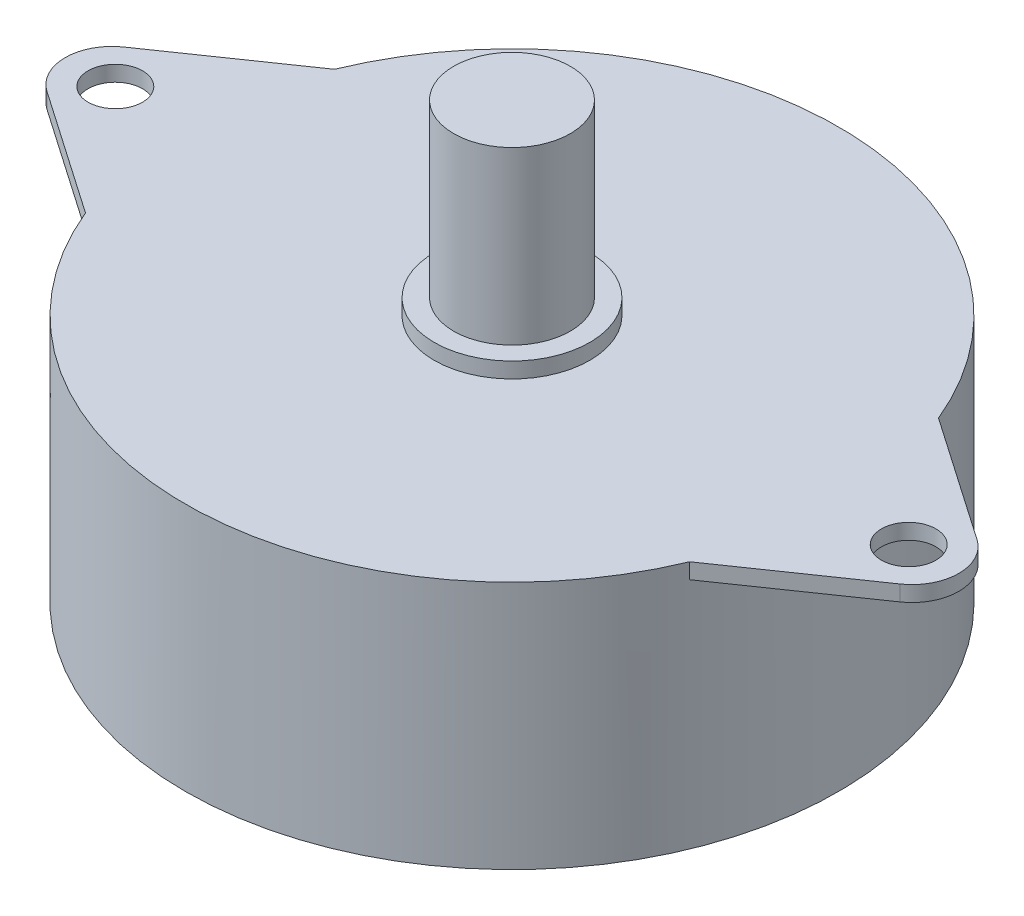
ISO-10303-21;
HEADER;
FILE_DESCRIPTION(('STEP AP214'),'2;1');
FILE_NAME('part.step','',(''),(''),'','','');
FILE_SCHEMA(('AUTOMOTIVE_DESIGN { 1 0 10303 214 1 1 1 1 }'));
ENDSEC;
DATA;
#1=APPLICATION_CONTEXT('core data for automotive mechanical design processes');
#2=APPLICATION_PROTOCOL_DEFINITION('international standard','automotive_design',2000,#1);
#3=PRODUCT_CONTEXT('',#1,'mechanical');
#4=PRODUCT('Part','Part','',(#3));
#5=PRODUCT_RELATED_PRODUCT_CATEGORY('part','',(#4));
#6=PRODUCT_DEFINITION_FORMATION('','',#4);
#7=PRODUCT_DEFINITION_CONTEXT('part definition',#1,'design');
#8=PRODUCT_DEFINITION('design','',#6,#7);
#9=PRODUCT_DEFINITION_SHAPE('','',#8);
#10=(LENGTH_UNIT() NAMED_UNIT(*) SI_UNIT(.MILLI.,.METRE.));
#11=(NAMED_UNIT(*) PLANE_ANGLE_UNIT() SI_UNIT($,.RADIAN.));
#12=(NAMED_UNIT(*) SI_UNIT($,.STERADIAN.) SOLID_ANGLE_UNIT());
#13=UNCERTAINTY_MEASURE_WITH_UNIT(LENGTH_MEASURE(1.E-05),#10,'distance_accuracy_value','');
#14=(GEOMETRIC_REPRESENTATION_CONTEXT(3) GLOBAL_UNCERTAINTY_ASSIGNED_CONTEXT((#13)) GLOBAL_UNIT_ASSIGNED_CONTEXT((#10,
#11,#12)) REPRESENTATION_CONTEXT('',''));
#15=CARTESIAN_POINT('',(0.,0.,0.));
#16=DIRECTION('',(0.,0.,1.));
#17=DIRECTION('',(1.,0.,0.));
#18=AXIS2_PLACEMENT_3D('',#15,#16,#17);
#19=CARTESIAN_POINT('',(0.,17.,0.));
#20=DIRECTION('',(0.,1.,0.));
#21=DIRECTION('',(0.,0.,1.));
#22=AXIS2_PLACEMENT_3D('',#19,#20,#21);
#23=PLANE('',#22);
#24=CARTESIAN_POINT('',(0.,17.,0.));
#25=DIRECTION('',(0.,1.,0.));
#26=DIRECTION('',(0.,0.,1.));
#27=AXIS2_PLACEMENT_3D('',#24,#25,#26);
#28=CIRCLE('',#27,5.);
#29=CARTESIAN_POINT('',(0.,17.,5.));
#30=VERTEX_POINT('',#29);
#31=EDGE_CURVE('E185',#30,#30,#28,.T.);
#32=ORIENTED_EDGE('',*,*,#31,.T.);
#33=EDGE_LOOP('',(#32));
#34=FACE_BOUND('',#33,.T.);
#35=CARTESIAN_POINT('',(0.,17.,0.));
#36=DIRECTION('',(0.,1.,0.));
#37=DIRECTION('',(0.,0.,1.));
#38=AXIS2_PLACEMENT_3D('',#35,#36,#37);
#39=CIRCLE('',#38,3.75);
#40=CARTESIAN_POINT('',(0.,17.,3.75));
#41=VERTEX_POINT('',#40);
#42=EDGE_CURVE('E194',#41,#41,#39,.T.);
#43=ORIENTED_EDGE('',*,*,#42,.F.);
#44=EDGE_LOOP('',(#43));
#45=FACE_BOUND('',#44,.T.);
#46=ADVANCED_FACE('F31',(#34,#45),#23,.T.);
#47=CARTESIAN_POINT('',(0.,16.,0.));
#48=DIRECTION('',(0.,1.,0.));
#49=DIRECTION('',(0.,0.,1.));
#50=AXIS2_PLACEMENT_3D('',#47,#48,#49);
#51=PLANE('',#50);
#52=CARTESIAN_POINT('',(25.5,16.,0.));
#53=DIRECTION('',(0.,1.,0.));
#54=DIRECTION('',(0.,0.,1.));
#55=AXIS2_PLACEMENT_3D('',#52,#53,#54);
#56=CIRCLE('',#55,1.75);
#57=CARTESIAN_POINT('',(25.5,16.,1.75));
#58=VERTEX_POINT('',#57);
#59=EDGE_CURVE('E182',#58,#58,#56,.T.);
#60=ORIENTED_EDGE('',*,*,#59,.F.);
#61=EDGE_LOOP('',(#60));
#62=FACE_BOUND('',#61,.T.);
#63=CARTESIAN_POINT('',(-25.5,16.,0.));
#64=DIRECTION('',(0.,1.,0.));
#65=DIRECTION('',(0.,0.,1.));
#66=AXIS2_PLACEMENT_3D('',#63,#64,#65);
#67=CIRCLE('',#66,1.75);
#68=CARTESIAN_POINT('',(-25.5,16.,1.75));
#69=VERTEX_POINT('',#68);
#70=EDGE_CURVE('E176',#69,#69,#67,.T.);
#71=ORIENTED_EDGE('',*,*,#70,.F.);
#72=EDGE_LOOP('',(#71));
#73=FACE_BOUND('',#72,.T.);
#74=CARTESIAN_POINT('',(0.,16.,0.));
#75=DIRECTION('',(0.,1.,0.));
#76=DIRECTION('',(0.,0.,1.));
#77=AXIS2_PLACEMENT_3D('',#74,#75,#76);
#78=CIRCLE('',#77,21.);
#79=CARTESIAN_POINT('',(19.4164878389476,16.,-8.00000000000001));
#80=VERTEX_POINT('',#79);
#81=CARTESIAN_POINT('',(-19.4164878389476,16.,-8.));
#82=VERTEX_POINT('',#81);
#83=EDGE_CURVE('E123',#80,#82,#78,.T.);
#84=ORIENTED_EDGE('',*,*,#83,.T.);
#85=DIRECTION('',(-0.822835097373695,0.,0.568280214797262));
#86=VECTOR('',#85,1.);
#87=CARTESIAN_POINT('',(-27.4257548661366,16.,-2.4685052921211));
#88=LINE('',#87,#86);
#89=CARTESIAN_POINT('',(-27.4257548661366,16.,-2.4685052921211));
#90=VERTEX_POINT('',#89);
#91=EDGE_CURVE('E152',#82,#90,#88,.T.);
#92=ORIENTED_EDGE('',*,*,#91,.T.);
#93=CARTESIAN_POINT('',(-25.7209142217449,16.,0.));
#94=DIRECTION('',(0.,1.,0.));
#95=DIRECTION('',(0.,0.,1.));
#96=AXIS2_PLACEMENT_3D('',#93,#94,#95);
#97=CIRCLE('',#96,3.);
#98=CARTESIAN_POINT('',(-27.4257548661366,16.,2.4685052921211));
#99=VERTEX_POINT('',#98);
#100=EDGE_CURVE('E158',#90,#99,#97,.T.);
#101=ORIENTED_EDGE('',*,*,#100,.T.);
#102=DIRECTION('',(0.822835097373695,0.,0.568280214797262));
#103=VECTOR('',#102,1.);
#104=CARTESIAN_POINT('',(-19.4164878389476,16.,8.));
#105=LINE('',#104,#103);
#106=CARTESIAN_POINT('',(-19.4164878389476,16.,8.00000000000001));
#107=VERTEX_POINT('',#106);
#108=EDGE_CURVE('E46',#99,#107,#105,.T.);
#109=ORIENTED_EDGE('',*,*,#108,.T.);
#110=CARTESIAN_POINT('',(19.4164878389476,16.,8.));
#111=VERTEX_POINT('',#110);
#112=EDGE_CURVE('E134',#107,#111,#78,.T.);
#113=ORIENTED_EDGE('',*,*,#112,.T.);
#114=DIRECTION('',(0.822835097373695,0.,-0.568280214797262));
#115=VECTOR('',#114,1.);
#116=CARTESIAN_POINT('',(27.4257548661366,16.,2.4685052921211));
#117=LINE('',#116,#115);
#118=CARTESIAN_POINT('',(27.4257548661366,16.,2.4685052921211));
#119=VERTEX_POINT('',#118);
#120=EDGE_CURVE('E103',#111,#119,#117,.T.);
#121=ORIENTED_EDGE('',*,*,#120,.T.);
#122=CARTESIAN_POINT('',(25.7209142217449,16.,0.));
#123=DIRECTION('',(0.,1.,0.));
#124=DIRECTION('',(0.,0.,-1.));
#125=AXIS2_PLACEMENT_3D('',#122,#123,#124);
#126=CIRCLE('',#125,3.);
#127=CARTESIAN_POINT('',(27.4257548661366,16.,-2.4685052921211));
#128=VERTEX_POINT('',#127);
#129=EDGE_CURVE('E163',#119,#128,#126,.T.);
#130=ORIENTED_EDGE('',*,*,#129,.T.);
#131=DIRECTION('',(-0.822835097373695,0.,-0.568280214797262));
#132=VECTOR('',#131,1.);
#133=CARTESIAN_POINT('',(19.4164878389476,16.,-8.));
#134=LINE('',#133,#132);
#135=EDGE_CURVE('E53',#128,#80,#134,.T.);
#136=ORIENTED_EDGE('',*,*,#135,.T.);
#137=EDGE_LOOP('',(#84,#92,#101,#109,#113,#121,#130,#136));
#138=FACE_BOUND('',#137,.T.);
#139=CARTESIAN_POINT('',(0.,16.,0.));
#140=DIRECTION('',(0.,1.,0.));
#141=DIRECTION('',(0.,0.,1.));
#142=AXIS2_PLACEMENT_3D('',#139,#140,#141);
#143=CIRCLE('',#142,5.);
#144=CARTESIAN_POINT('',(0.,16.,5.));
#145=VERTEX_POINT('',#144);
#146=EDGE_CURVE('E188',#145,#145,#143,.T.);
#147=ORIENTED_EDGE('',*,*,#146,.F.);
#148=EDGE_LOOP('',(#147));
#149=FACE_BOUND('',#148,.T.);
#150=ADVANCED_FACE('F160',(#62,#73,#138,#149),#51,.T.);
#151=CARTESIAN_POINT('',(0.,16.,0.));
#152=DIRECTION('',(0.,-1.,0.));
#153=DIRECTION('',(0.,0.,-1.));
#154=AXIS2_PLACEMENT_3D('',#151,#152,#153);
#155=CYLINDRICAL_SURFACE('',#154,21.);
#156=ORIENTED_EDGE('',*,*,#83,.F.);
#157=DIRECTION('',(0.,1.,0.));
#158=VECTOR('',#157,1.);
#159=CARTESIAN_POINT('',(19.4164878389476,15.,-8.));
#160=LINE('',#159,#158);
#161=CARTESIAN_POINT('',(19.4164878389476,15.,-8.));
#162=VERTEX_POINT('',#161);
#163=EDGE_CURVE('E121',#162,#80,#160,.T.);
#164=ORIENTED_EDGE('',*,*,#163,.F.);
#165=CARTESIAN_POINT('',(0.,15.,0.));
#166=DIRECTION('',(0.,1.,0.));
#167=DIRECTION('',(0.,0.,1.));
#168=AXIS2_PLACEMENT_3D('',#165,#166,#167);
#169=CIRCLE('',#168,21.);
#170=CARTESIAN_POINT('',(19.4164878389476,15.,8.));
#171=VERTEX_POINT('',#170);
#172=EDGE_CURVE('E11',#171,#162,#169,.T.);
#173=ORIENTED_EDGE('',*,*,#172,.F.);
#174=DIRECTION('',(0.,1.,0.));
#175=VECTOR('',#174,1.);
#176=CARTESIAN_POINT('',(19.4164878389476,15.,8.));
#177=LINE('',#176,#175);
#178=EDGE_CURVE('E98',#171,#111,#177,.T.);
#179=ORIENTED_EDGE('',*,*,#178,.T.);
#180=ORIENTED_EDGE('',*,*,#112,.F.);
#181=DIRECTION('',(0.,1.,0.));
#182=VECTOR('',#181,1.);
#183=CARTESIAN_POINT('',(-19.4164878389476,15.,8.));
#184=LINE('',#183,#182);
#185=CARTESIAN_POINT('',(-19.4164878389476,15.,8.));
#186=VERTEX_POINT('',#185);
#187=EDGE_CURVE('E137',#186,#107,#184,.T.);
#188=ORIENTED_EDGE('',*,*,#187,.F.);
#189=CARTESIAN_POINT('',(-19.4164878389476,15.,-8.));
#190=VERTEX_POINT('',#189);
#191=EDGE_CURVE('E35',#190,#186,#169,.T.);
#192=ORIENTED_EDGE('',*,*,#191,.F.);
#193=DIRECTION('',(0.,1.,0.));
#194=VECTOR('',#193,1.);
#195=CARTESIAN_POINT('',(-19.4164878389476,15.,-8.));
#196=LINE('',#195,#194);
#197=EDGE_CURVE('E125',#190,#82,#196,.T.);
#198=ORIENTED_EDGE('',*,*,#197,.T.);
#199=EDGE_LOOP('',(#156,#164,#173,#179,#180,#188,#192,#198));
#200=FACE_BOUND('',#199,.T.);
#201=CARTESIAN_POINT('',(0.,0.,0.));
#202=DIRECTION('',(0.,1.,0.));
#203=DIRECTION('',(0.,0.,1.));
#204=AXIS2_PLACEMENT_3D('',#201,#202,#203);
#205=CIRCLE('',#204,21.);
#206=CARTESIAN_POINT('',(0.,0.,21.));
#207=VERTEX_POINT('',#206);
#208=EDGE_CURVE('E135',#207,#207,#205,.T.);
#209=ORIENTED_EDGE('',*,*,#208,.T.);
#210=EDGE_LOOP('',(#209));
#211=FACE_BOUND('',#210,.T.);
#212=ADVANCED_FACE('F33',(#200,#211),#155,.T.);
#213=CARTESIAN_POINT('',(0.,0.,0.));
#214=DIRECTION('',(0.,1.,0.));
#215=DIRECTION('',(0.,0.,1.));
#216=AXIS2_PLACEMENT_3D('',#213,#214,#215);
#217=PLANE('',#216);
#218=ORIENTED_EDGE('',*,*,#208,.F.);
#219=EDGE_LOOP('',(#218));
#220=FACE_BOUND('',#219,.T.);
#221=ADVANCED_FACE('F240',(#220),#217,.F.);
#222=CARTESIAN_POINT('',(-25.7209142217449,15.,0.));
#223=DIRECTION('',(0.,1.,0.));
#224=DIRECTION('',(0.,0.,1.));
#225=AXIS2_PLACEMENT_3D('',#222,#223,#224);
#226=CYLINDRICAL_SURFACE('',#225,3.);
#227=ORIENTED_EDGE('',*,*,#100,.F.);
#228=DIRECTION('',(0.,1.,0.));
#229=VECTOR('',#228,1.);
#230=CARTESIAN_POINT('',(-27.4257548661366,15.,-2.4685052921211));
#231=LINE('',#230,#229);
#232=CARTESIAN_POINT('',(-27.4257548661366,15.,-2.4685052921211));
#233=VERTEX_POINT('',#232);
#234=EDGE_CURVE('E128',#233,#90,#231,.T.);
#235=ORIENTED_EDGE('',*,*,#234,.F.);
#236=CARTESIAN_POINT('',(-25.7209142217449,15.,0.));
#237=DIRECTION('',(0.,1.,0.));
#238=DIRECTION('',(0.,0.,1.));
#239=AXIS2_PLACEMENT_3D('',#236,#237,#238);
#240=CIRCLE('',#239,3.);
#241=CARTESIAN_POINT('',(-27.4257548661366,15.,2.4685052921211));
#242=VERTEX_POINT('',#241);
#243=EDGE_CURVE('E170',#233,#242,#240,.T.);
#244=ORIENTED_EDGE('',*,*,#243,.T.);
#245=DIRECTION('',(0.,1.,0.));
#246=VECTOR('',#245,1.);
#247=CARTESIAN_POINT('',(-27.4257548661366,15.,2.4685052921211));
#248=LINE('',#247,#246);
#249=EDGE_CURVE('E139',#242,#99,#248,.T.);
#250=ORIENTED_EDGE('',*,*,#249,.T.);
#251=EDGE_LOOP('',(#227,#235,#244,#250));
#252=FACE_BOUND('',#251,.T.);
#253=ADVANCED_FACE('F159',(#252),#226,.T.);
#254=CARTESIAN_POINT('',(-25.5,15.,0.));
#255=DIRECTION('',(0.,1.,0.));
#256=DIRECTION('',(0.,0.,1.));
#257=AXIS2_PLACEMENT_3D('',#254,#255,#256);
#258=CYLINDRICAL_SURFACE('',#257,1.75);
#259=CARTESIAN_POINT('',(-25.5,15.,0.));
#260=DIRECTION('',(0.,1.,0.));
#261=DIRECTION('',(0.,0.,1.));
#262=AXIS2_PLACEMENT_3D('',#259,#260,#261);
#263=CIRCLE('',#262,1.75);
#264=CARTESIAN_POINT('',(-25.5,15.,1.75));
#265=VERTEX_POINT('',#264);
#266=EDGE_CURVE('E168',#265,#265,#263,.T.);
#267=ORIENTED_EDGE('',*,*,#266,.F.);
#268=EDGE_LOOP('',(#267));
#269=FACE_BOUND('',#268,.T.);
#270=ORIENTED_EDGE('',*,*,#70,.T.);
#271=EDGE_LOOP('',(#270));
#272=FACE_BOUND('',#271,.T.);
#273=ADVANCED_FACE('F226',(#269,#272),#258,.F.);
#274=CARTESIAN_POINT('',(-25.7209142217449,15.,0.));
#275=DIRECTION('',(0.,1.,0.));
#276=DIRECTION('',(0.,0.,1.));
#277=AXIS2_PLACEMENT_3D('',#274,#275,#276);
#278=PLANE('',#277);
#279=ORIENTED_EDGE('',*,*,#266,.T.);
#280=EDGE_LOOP('',(#279));
#281=FACE_BOUND('',#280,.T.);
#282=DIRECTION('',(-0.822835097373695,0.,0.568280214797262));
#283=VECTOR('',#282,1.);
#284=CARTESIAN_POINT('',(-27.4257548661366,15.,-2.4685052921211));
#285=LINE('',#284,#283);
#286=EDGE_CURVE('E154',#190,#233,#285,.T.);
#287=ORIENTED_EDGE('',*,*,#286,.F.);
#288=ORIENTED_EDGE('',*,*,#191,.T.);
#289=DIRECTION('',(0.822835097373695,0.,0.568280214797262));
#290=VECTOR('',#289,1.);
#291=CARTESIAN_POINT('',(-19.4164878389476,15.,8.));
#292=LINE('',#291,#290);
#293=EDGE_CURVE('E108',#242,#186,#292,.T.);
#294=ORIENTED_EDGE('',*,*,#293,.F.);
#295=ORIENTED_EDGE('',*,*,#243,.F.);
#296=EDGE_LOOP('',(#287,#288,#294,#295));
#297=FACE_BOUND('',#296,.T.);
#298=ADVANCED_FACE('F229',(#281,#297),#278,.F.);
#299=CARTESIAN_POINT('',(-27.4257548661366,15.,-2.4685052921211));
#300=DIRECTION('',(-0.568280214797262,0.,-0.822835097373695));
#301=DIRECTION('',(-0.822835097373695,0.,0.568280214797262));
#302=AXIS2_PLACEMENT_3D('',#299,#300,#301);
#303=PLANE('',#302);
#304=ORIENTED_EDGE('',*,*,#91,.F.);
#305=ORIENTED_EDGE('',*,*,#197,.F.);
#306=ORIENTED_EDGE('',*,*,#286,.T.);
#307=ORIENTED_EDGE('',*,*,#234,.T.);
#308=EDGE_LOOP('',(#304,#305,#306,#307));
#309=FACE_BOUND('',#308,.T.);
#310=ADVANCED_FACE('F150',(#309),#303,.T.);
#311=CARTESIAN_POINT('',(-19.4164878389476,15.,8.));
#312=DIRECTION('',(-0.568280214797262,0.,0.822835097373695));
#313=DIRECTION('',(0.822835097373695,0.,0.568280214797262));
#314=AXIS2_PLACEMENT_3D('',#311,#312,#313);
#315=PLANE('',#314);
#316=ORIENTED_EDGE('',*,*,#108,.F.);
#317=ORIENTED_EDGE('',*,*,#249,.F.);
#318=ORIENTED_EDGE('',*,*,#293,.T.);
#319=ORIENTED_EDGE('',*,*,#187,.T.);
#320=EDGE_LOOP('',(#316,#317,#318,#319));
#321=FACE_BOUND('',#320,.T.);
#322=ADVANCED_FACE('F234',(#321),#315,.T.);
#323=CARTESIAN_POINT('',(25.5,15.,0.));
#324=DIRECTION('',(0.,1.,0.));
#325=DIRECTION('',(0.,0.,1.));
#326=AXIS2_PLACEMENT_3D('',#323,#324,#325);
#327=CIRCLE('',#326,1.75);
#328=CARTESIAN_POINT('',(25.5,15.,1.75));
#329=VERTEX_POINT('',#328);
#330=EDGE_CURVE('E179',#329,#329,#327,.T.);
#331=ORIENTED_EDGE('',*,*,#330,.T.);
#332=EDGE_LOOP('',(#331));
#333=FACE_BOUND('',#332,.T.);
#334=DIRECTION('',(0.822835097373695,0.,-0.568280214797262));
#335=VECTOR('',#334,1.);
#336=CARTESIAN_POINT('',(27.4257548661366,15.,2.4685052921211));
#337=LINE('',#336,#335);
#338=CARTESIAN_POINT('',(27.4257548661366,15.,2.4685052921211));
#339=VERTEX_POINT('',#338);
#340=EDGE_CURVE('E101',#171,#339,#337,.T.);
#341=ORIENTED_EDGE('',*,*,#340,.F.);
#342=ORIENTED_EDGE('',*,*,#172,.T.);
#343=DIRECTION('',(-0.822835097373695,0.,-0.568280214797262));
#344=VECTOR('',#343,1.);
#345=CARTESIAN_POINT('',(19.4164878389476,15.,-8.));
#346=LINE('',#345,#344);
#347=CARTESIAN_POINT('',(27.4257548661366,15.,-2.4685052921211));
#348=VERTEX_POINT('',#347);
#349=EDGE_CURVE('E173',#348,#162,#346,.T.);
#350=ORIENTED_EDGE('',*,*,#349,.F.);
#351=CARTESIAN_POINT('',(25.7209142217449,15.,0.));
#352=DIRECTION('',(0.,1.,0.));
#353=DIRECTION('',(0.,0.,-1.));
#354=AXIS2_PLACEMENT_3D('',#351,#352,#353);
#355=CIRCLE('',#354,3.);
#356=EDGE_CURVE('E116',#339,#348,#355,.T.);
#357=ORIENTED_EDGE('',*,*,#356,.F.);
#358=EDGE_LOOP('',(#341,#342,#350,#357));
#359=FACE_BOUND('',#358,.T.);
#360=ADVANCED_FACE('F112',(#333,#359),#278,.F.);
#361=CARTESIAN_POINT('',(19.4164878389476,15.,-8.));
#362=DIRECTION('',(0.568280214797262,0.,-0.822835097373695));
#363=DIRECTION('',(-0.822835097373695,0.,-0.568280214797262));
#364=AXIS2_PLACEMENT_3D('',#361,#362,#363);
#365=PLANE('',#364);
#366=ORIENTED_EDGE('',*,*,#135,.F.);
#367=DIRECTION('',(0.,1.,0.));
#368=VECTOR('',#367,1.);
#369=CARTESIAN_POINT('',(27.4257548661366,15.,-2.4685052921211));
#370=LINE('',#369,#368);
#371=EDGE_CURVE('E126',#348,#128,#370,.T.);
#372=ORIENTED_EDGE('',*,*,#371,.F.);
#373=ORIENTED_EDGE('',*,*,#349,.T.);
#374=ORIENTED_EDGE('',*,*,#163,.T.);
#375=EDGE_LOOP('',(#366,#372,#373,#374));
#376=FACE_BOUND('',#375,.T.);
#377=ADVANCED_FACE('F233',(#376),#365,.T.);
#378=CARTESIAN_POINT('',(25.7209142217449,15.,0.));
#379=DIRECTION('',(0.,1.,0.));
#380=DIRECTION('',(0.,0.,1.));
#381=AXIS2_PLACEMENT_3D('',#378,#379,#380);
#382=CYLINDRICAL_SURFACE('',#381,3.);
#383=ORIENTED_EDGE('',*,*,#129,.F.);
#384=DIRECTION('',(0.,1.,0.));
#385=VECTOR('',#384,1.);
#386=CARTESIAN_POINT('',(27.4257548661366,15.,2.4685052921211));
#387=LINE('',#386,#385);
#388=EDGE_CURVE('E107',#339,#119,#387,.T.);
#389=ORIENTED_EDGE('',*,*,#388,.F.);
#390=ORIENTED_EDGE('',*,*,#356,.T.);
#391=ORIENTED_EDGE('',*,*,#371,.T.);
#392=EDGE_LOOP('',(#383,#389,#390,#391));
#393=FACE_BOUND('',#392,.T.);
#394=ADVANCED_FACE('F245',(#393),#382,.T.);
#395=CARTESIAN_POINT('',(27.4257548661366,15.,2.4685052921211));
#396=DIRECTION('',(0.568280214797262,0.,0.822835097373695));
#397=DIRECTION('',(0.822835097373695,0.,-0.568280214797262));
#398=AXIS2_PLACEMENT_3D('',#395,#396,#397);
#399=PLANE('',#398);
#400=ORIENTED_EDGE('',*,*,#120,.F.);
#401=ORIENTED_EDGE('',*,*,#178,.F.);
#402=ORIENTED_EDGE('',*,*,#340,.T.);
#403=ORIENTED_EDGE('',*,*,#388,.T.);
#404=EDGE_LOOP('',(#400,#401,#402,#403));
#405=FACE_BOUND('',#404,.T.);
#406=ADVANCED_FACE('F100',(#405),#399,.T.);
#407=CARTESIAN_POINT('',(25.5,15.,0.));
#408=DIRECTION('',(0.,1.,0.));
#409=DIRECTION('',(0.,0.,1.));
#410=AXIS2_PLACEMENT_3D('',#407,#408,#409);
#411=CYLINDRICAL_SURFACE('',#410,1.75);
#412=ORIENTED_EDGE('',*,*,#330,.F.);
#413=EDGE_LOOP('',(#412));
#414=FACE_BOUND('',#413,.T.);
#415=ORIENTED_EDGE('',*,*,#59,.T.);
#416=EDGE_LOOP('',(#415));
#417=FACE_BOUND('',#416,.T.);
#418=ADVANCED_FACE('F221',(#414,#417),#411,.F.);
#419=CARTESIAN_POINT('',(0.,17.,0.));
#420=DIRECTION('',(0.,-1.,0.));
#421=DIRECTION('',(0.,0.,-1.));
#422=AXIS2_PLACEMENT_3D('',#419,#420,#421);
#423=CYLINDRICAL_SURFACE('',#422,5.);
#424=ORIENTED_EDGE('',*,*,#31,.F.);
#425=EDGE_LOOP('',(#424));
#426=FACE_BOUND('',#425,.T.);
#427=ORIENTED_EDGE('',*,*,#146,.T.);
#428=EDGE_LOOP('',(#427));
#429=FACE_BOUND('',#428,.T.);
#430=ADVANCED_FACE('F205',(#426,#429),#423,.T.);
#431=CARTESIAN_POINT('',(0.,28.,0.));
#432=DIRECTION('',(0.,-1.,0.));
#433=DIRECTION('',(0.,0.,-1.));
#434=AXIS2_PLACEMENT_3D('',#431,#432,#433);
#435=CYLINDRICAL_SURFACE('',#434,3.75);
#436=CARTESIAN_POINT('',(0.,28.,0.));
#437=DIRECTION('',(0.,1.,0.));
#438=DIRECTION('',(0.,0.,1.));
#439=AXIS2_PLACEMENT_3D('',#436,#437,#438);
#440=CIRCLE('',#439,3.75);
#441=CARTESIAN_POINT('',(0.,28.,3.75));
#442=VERTEX_POINT('',#441);
#443=EDGE_CURVE('E191',#442,#442,#440,.T.);
#444=ORIENTED_EDGE('',*,*,#443,.F.);
#445=EDGE_LOOP('',(#444));
#446=FACE_BOUND('',#445,.T.);
#447=ORIENTED_EDGE('',*,*,#42,.T.);
#448=EDGE_LOOP('',(#447));
#449=FACE_BOUND('',#448,.T.);
#450=ADVANCED_FACE('F202',(#446,#449),#435,.T.);
#451=CARTESIAN_POINT('',(0.,28.,0.));
#452=DIRECTION('',(0.,1.,0.));
#453=DIRECTION('',(0.,0.,1.));
#454=AXIS2_PLACEMENT_3D('',#451,#452,#453);
#455=PLANE('',#454);
#456=ORIENTED_EDGE('',*,*,#443,.T.);
#457=EDGE_LOOP('',(#456));
#458=FACE_BOUND('',#457,.T.);
#459=ADVANCED_FACE('F200',(#458),#455,.T.);
#460=CLOSED_SHELL('',(#46,#150,#212,#221,#253,#273,#298,#310,#322,#360,#377,#394,#406,#418,#430,
#450,#459));
#461=MANIFOLD_SOLID_BREP('B2',#460);
#462=ADVANCED_BREP_SHAPE_REPRESENTATION('',(#18,#461),#14);
#463=SHAPE_DEFINITION_REPRESENTATION(#9,#462);
ENDSEC;
END-ISO-10303-21;
